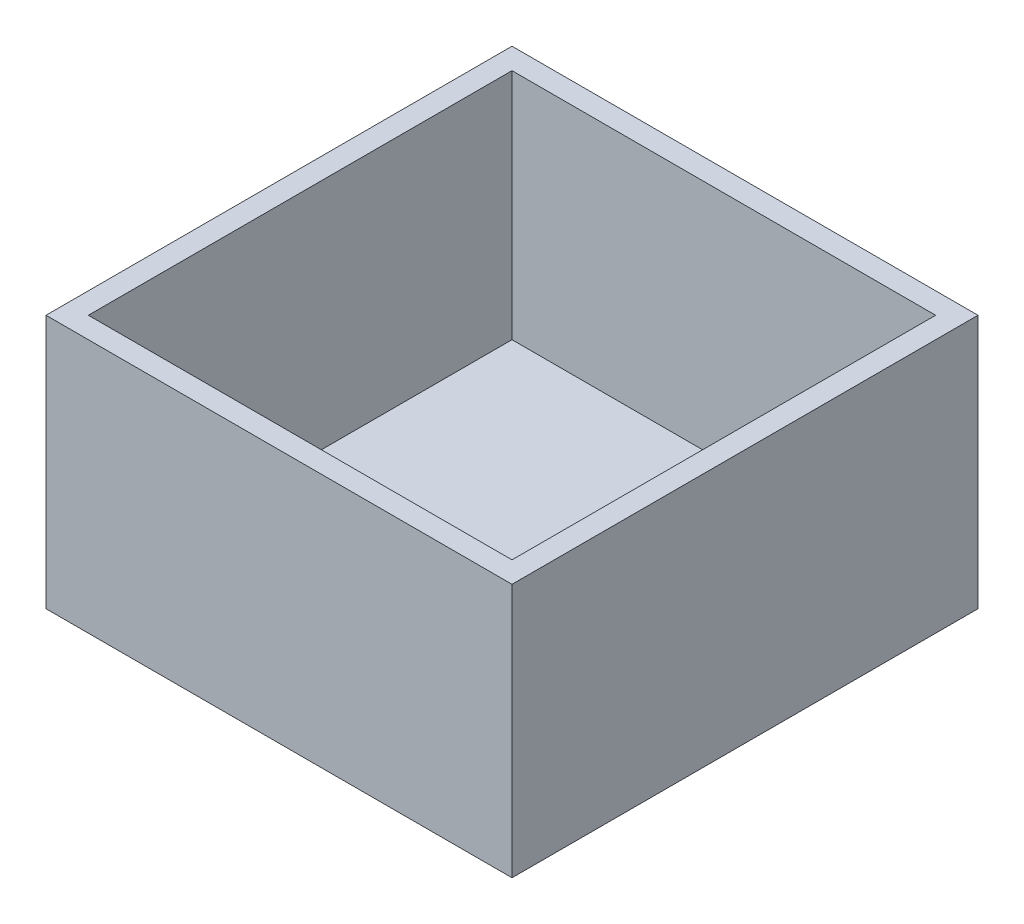
ISO-10303-21;
HEADER;
FILE_DESCRIPTION(('STEP AP214'),'2;1');
FILE_NAME('part.step','',(''),(''),'','','');
FILE_SCHEMA(('AUTOMOTIVE_DESIGN { 1 0 10303 214 1 1 1 1 }'));
ENDSEC;
DATA;
#1=APPLICATION_CONTEXT('core data for automotive mechanical design processes');
#2=APPLICATION_PROTOCOL_DEFINITION('international standard','automotive_design',2000,#1);
#3=PRODUCT_CONTEXT('',#1,'mechanical');
#4=PRODUCT('Part','Part','',(#3));
#5=PRODUCT_RELATED_PRODUCT_CATEGORY('part','',(#4));
#6=PRODUCT_DEFINITION_FORMATION('','',#4);
#7=PRODUCT_DEFINITION_CONTEXT('part definition',#1,'design');
#8=PRODUCT_DEFINITION('design','',#6,#7);
#9=PRODUCT_DEFINITION_SHAPE('','',#8);
#10=(LENGTH_UNIT() NAMED_UNIT(*) SI_UNIT(.MILLI.,.METRE.));
#11=(NAMED_UNIT(*) PLANE_ANGLE_UNIT() SI_UNIT($,.RADIAN.));
#12=(NAMED_UNIT(*) SI_UNIT($,.STERADIAN.) SOLID_ANGLE_UNIT());
#13=UNCERTAINTY_MEASURE_WITH_UNIT(LENGTH_MEASURE(1.E-05),#10,'distance_accuracy_value','');
#14=(GEOMETRIC_REPRESENTATION_CONTEXT(3) GLOBAL_UNCERTAINTY_ASSIGNED_CONTEXT((#13)) GLOBAL_UNIT_ASSIGNED_CONTEXT((#10,
#11,#12)) REPRESENTATION_CONTEXT('',''));
#15=CARTESIAN_POINT('',(0.,0.,0.));
#16=DIRECTION('',(0.,0.,1.));
#17=DIRECTION('',(1.,0.,0.));
#18=AXIS2_PLACEMENT_3D('',#15,#16,#17);
#19=CARTESIAN_POINT('',(0.,76.2,0.));
#20=DIRECTION('',(0.,-1.,0.));
#21=DIRECTION('',(0.,0.,-1.));
#22=AXIS2_PLACEMENT_3D('',#19,#20,#21);
#23=PLANE('',#22);
#24=DIRECTION('',(0.,0.,-1.));
#25=VECTOR('',#24,1.);
#26=CARTESIAN_POINT('',(69.85,76.2,69.85));
#27=LINE('',#26,#25);
#28=CARTESIAN_POINT('',(69.85,76.2,69.85));
#29=VERTEX_POINT('',#28);
#30=CARTESIAN_POINT('',(69.85,76.2,-69.85));
#31=VERTEX_POINT('',#30);
#32=EDGE_CURVE('E157',#29,#31,#27,.T.);
#33=ORIENTED_EDGE('',*,*,#32,.T.);
#34=DIRECTION('',(-1.,0.,0.));
#35=VECTOR('',#34,1.);
#36=CARTESIAN_POINT('',(-69.85,76.2,-69.85));
#37=LINE('',#36,#35);
#38=CARTESIAN_POINT('',(-69.85,76.2,-69.85));
#39=VERTEX_POINT('',#38);
#40=EDGE_CURVE('E92',#31,#39,#37,.T.);
#41=ORIENTED_EDGE('',*,*,#40,.T.);
#42=DIRECTION('',(0.,0.,1.));
#43=VECTOR('',#42,1.);
#44=CARTESIAN_POINT('',(-69.85,76.2,69.85));
#45=LINE('',#44,#43);
#46=CARTESIAN_POINT('',(-69.85,76.2,69.85));
#47=VERTEX_POINT('',#46);
#48=EDGE_CURVE('E162',#39,#47,#45,.T.);
#49=ORIENTED_EDGE('',*,*,#48,.T.);
#50=DIRECTION('',(1.,0.,0.));
#51=VECTOR('',#50,1.);
#52=CARTESIAN_POINT('',(-69.85,76.2,69.85));
#53=LINE('',#52,#51);
#54=EDGE_CURVE('E64',#47,#29,#53,.T.);
#55=ORIENTED_EDGE('',*,*,#54,.T.);
#56=EDGE_LOOP('',(#33,#41,#49,#55));
#57=FACE_BOUND('',#56,.T.);
#58=DIRECTION('',(0.,0.,-1.));
#59=VECTOR('',#58,1.);
#60=CARTESIAN_POINT('',(63.5,76.2,0.));
#61=LINE('',#60,#59);
#62=CARTESIAN_POINT('',(63.5,76.2,63.5));
#63=VERTEX_POINT('',#62);
#64=CARTESIAN_POINT('',(63.5,76.2,-63.5));
#65=VERTEX_POINT('',#64);
#66=EDGE_CURVE('E141',#63,#65,#61,.T.);
#67=ORIENTED_EDGE('',*,*,#66,.F.);
#68=DIRECTION('',(1.,0.,0.));
#69=VECTOR('',#68,1.);
#70=CARTESIAN_POINT('',(0.,76.2,63.5));
#71=LINE('',#70,#69);
#72=CARTESIAN_POINT('',(-63.5,76.2,63.5));
#73=VERTEX_POINT('',#72);
#74=EDGE_CURVE('E154',#73,#63,#71,.T.);
#75=ORIENTED_EDGE('',*,*,#74,.F.);
#76=DIRECTION('',(0.,0.,1.));
#77=VECTOR('',#76,1.);
#78=CARTESIAN_POINT('',(-63.5,76.2,0.));
#79=LINE('',#78,#77);
#80=CARTESIAN_POINT('',(-63.5,76.2,-63.5));
#81=VERTEX_POINT('',#80);
#82=EDGE_CURVE('E151',#81,#73,#79,.T.);
#83=ORIENTED_EDGE('',*,*,#82,.F.);
#84=DIRECTION('',(-1.,0.,0.));
#85=VECTOR('',#84,1.);
#86=CARTESIAN_POINT('',(0.,76.2,-63.5));
#87=LINE('',#86,#85);
#88=EDGE_CURVE('E130',#65,#81,#87,.T.);
#89=ORIENTED_EDGE('',*,*,#88,.F.);
#90=EDGE_LOOP('',(#67,#75,#83,#89));
#91=FACE_BOUND('',#90,.T.);
#92=ADVANCED_FACE('F39',(#57,#91),#23,.F.);
#93=CARTESIAN_POINT('',(69.85,76.2,69.85));
#94=DIRECTION('',(-1.,0.,0.));
#95=DIRECTION('',(0.,0.,1.));
#96=AXIS2_PLACEMENT_3D('',#93,#94,#95);
#97=PLANE('',#96);
#98=DIRECTION('',(0.,0.,-1.));
#99=VECTOR('',#98,1.);
#100=CARTESIAN_POINT('',(69.85,0.,69.85));
#101=LINE('',#100,#99);
#102=CARTESIAN_POINT('',(69.85,0.,69.85));
#103=VERTEX_POINT('',#102);
#104=CARTESIAN_POINT('',(69.85,0.,-69.85));
#105=VERTEX_POINT('',#104);
#106=EDGE_CURVE('E168',#103,#105,#101,.T.);
#107=ORIENTED_EDGE('',*,*,#106,.T.);
#108=DIRECTION('',(0.,-1.,0.));
#109=VECTOR('',#108,1.);
#110=CARTESIAN_POINT('',(69.85,76.2,-69.85));
#111=LINE('',#110,#109);
#112=EDGE_CURVE('E11',#31,#105,#111,.T.);
#113=ORIENTED_EDGE('',*,*,#112,.F.);
#114=ORIENTED_EDGE('',*,*,#32,.F.);
#115=DIRECTION('',(0.,-1.,0.));
#116=VECTOR('',#115,1.);
#117=CARTESIAN_POINT('',(69.85,76.2,69.85));
#118=LINE('',#117,#116);
#119=EDGE_CURVE('E167',#29,#103,#118,.T.);
#120=ORIENTED_EDGE('',*,*,#119,.T.);
#121=EDGE_LOOP('',(#107,#113,#114,#120));
#122=FACE_BOUND('',#121,.T.);
#123=ADVANCED_FACE('F41',(#122),#97,.F.);
#124=CARTESIAN_POINT('',(-69.85,76.2,-69.85));
#125=DIRECTION('',(0.,0.,1.));
#126=DIRECTION('',(1.,0.,0.));
#127=AXIS2_PLACEMENT_3D('',#124,#125,#126);
#128=PLANE('',#127);
#129=DIRECTION('',(-1.,0.,0.));
#130=VECTOR('',#129,1.);
#131=CARTESIAN_POINT('',(-69.85,0.,-69.85));
#132=LINE('',#131,#130);
#133=CARTESIAN_POINT('',(-69.85,0.,-69.85));
#134=VERTEX_POINT('',#133);
#135=EDGE_CURVE('E172',#105,#134,#132,.T.);
#136=ORIENTED_EDGE('',*,*,#135,.T.);
#137=DIRECTION('',(0.,-1.,0.));
#138=VECTOR('',#137,1.);
#139=CARTESIAN_POINT('',(-69.85,76.2,-69.85));
#140=LINE('',#139,#138);
#141=EDGE_CURVE('E48',#39,#134,#140,.T.);
#142=ORIENTED_EDGE('',*,*,#141,.F.);
#143=ORIENTED_EDGE('',*,*,#40,.F.);
#144=ORIENTED_EDGE('',*,*,#112,.T.);
#145=EDGE_LOOP('',(#136,#142,#143,#144));
#146=FACE_BOUND('',#145,.T.);
#147=ADVANCED_FACE('F206',(#146),#128,.F.);
#148=CARTESIAN_POINT('',(-69.85,76.2,69.85));
#149=DIRECTION('',(1.,0.,0.));
#150=DIRECTION('',(0.,0.,-1.));
#151=AXIS2_PLACEMENT_3D('',#148,#149,#150);
#152=PLANE('',#151);
#153=DIRECTION('',(0.,0.,1.));
#154=VECTOR('',#153,1.);
#155=CARTESIAN_POINT('',(-69.85,0.,69.85));
#156=LINE('',#155,#154);
#157=CARTESIAN_POINT('',(-69.85,0.,69.85));
#158=VERTEX_POINT('',#157);
#159=EDGE_CURVE('E175',#134,#158,#156,.T.);
#160=ORIENTED_EDGE('',*,*,#159,.T.);
#161=DIRECTION('',(0.,-1.,0.));
#162=VECTOR('',#161,1.);
#163=CARTESIAN_POINT('',(-69.85,76.2,69.85));
#164=LINE('',#163,#162);
#165=EDGE_CURVE('E182',#47,#158,#164,.T.);
#166=ORIENTED_EDGE('',*,*,#165,.F.);
#167=ORIENTED_EDGE('',*,*,#48,.F.);
#168=ORIENTED_EDGE('',*,*,#141,.T.);
#169=EDGE_LOOP('',(#160,#166,#167,#168));
#170=FACE_BOUND('',#169,.T.);
#171=ADVANCED_FACE('F189',(#170),#152,.F.);
#172=CARTESIAN_POINT('',(-69.85,76.2,69.85));
#173=DIRECTION('',(0.,0.,-1.));
#174=DIRECTION('',(-1.,0.,0.));
#175=AXIS2_PLACEMENT_3D('',#172,#173,#174);
#176=PLANE('',#175);
#177=DIRECTION('',(1.,0.,0.));
#178=VECTOR('',#177,1.);
#179=CARTESIAN_POINT('',(-69.85,0.,69.85));
#180=LINE('',#179,#178);
#181=EDGE_CURVE('E85',#158,#103,#180,.T.);
#182=ORIENTED_EDGE('',*,*,#181,.T.);
#183=ORIENTED_EDGE('',*,*,#119,.F.);
#184=ORIENTED_EDGE('',*,*,#54,.F.);
#185=ORIENTED_EDGE('',*,*,#165,.T.);
#186=EDGE_LOOP('',(#182,#183,#184,#185));
#187=FACE_BOUND('',#186,.T.);
#188=ADVANCED_FACE('F197',(#187),#176,.F.);
#189=CARTESIAN_POINT('',(0.,0.,0.));
#190=DIRECTION('',(0.,-1.,0.));
#191=DIRECTION('',(0.,0.,-1.));
#192=AXIS2_PLACEMENT_3D('',#189,#190,#191);
#193=PLANE('',#192);
#194=ORIENTED_EDGE('',*,*,#106,.F.);
#195=ORIENTED_EDGE('',*,*,#181,.F.);
#196=ORIENTED_EDGE('',*,*,#159,.F.);
#197=ORIENTED_EDGE('',*,*,#135,.F.);
#198=EDGE_LOOP('',(#194,#195,#196,#197));
#199=FACE_BOUND('',#198,.T.);
#200=ADVANCED_FACE('F193',(#199),#193,.T.);
#201=CARTESIAN_POINT('',(63.5,76.2,69.85));
#202=DIRECTION('',(-1.,0.,0.));
#203=DIRECTION('',(0.,0.,1.));
#204=AXIS2_PLACEMENT_3D('',#201,#202,#203);
#205=PLANE('',#204);
#206=DIRECTION('',(0.,0.,-1.));
#207=VECTOR('',#206,1.);
#208=CARTESIAN_POINT('',(63.5,6.35,0.));
#209=LINE('',#208,#207);
#210=CARTESIAN_POINT('',(63.5,6.35,63.5));
#211=VERTEX_POINT('',#210);
#212=CARTESIAN_POINT('',(63.5,6.35,-63.5));
#213=VERTEX_POINT('',#212);
#214=EDGE_CURVE('E120',#211,#213,#209,.T.);
#215=ORIENTED_EDGE('',*,*,#214,.F.);
#216=DIRECTION('',(0.,-1.,0.));
#217=VECTOR('',#216,1.);
#218=CARTESIAN_POINT('',(63.5,76.2,63.5));
#219=LINE('',#218,#217);
#220=EDGE_CURVE('E145',#63,#211,#219,.T.);
#221=ORIENTED_EDGE('',*,*,#220,.F.);
#222=ORIENTED_EDGE('',*,*,#66,.T.);
#223=DIRECTION('',(0.,-1.,0.));
#224=VECTOR('',#223,1.);
#225=CARTESIAN_POINT('',(63.5,76.2,-63.5));
#226=LINE('',#225,#224);
#227=EDGE_CURVE('E134',#65,#213,#226,.T.);
#228=ORIENTED_EDGE('',*,*,#227,.T.);
#229=EDGE_LOOP('',(#215,#221,#222,#228));
#230=FACE_BOUND('',#229,.T.);
#231=ADVANCED_FACE('F204',(#230),#205,.T.);
#232=CARTESIAN_POINT('',(-69.85,76.2,-63.5));
#233=DIRECTION('',(0.,0.,1.));
#234=DIRECTION('',(1.,0.,0.));
#235=AXIS2_PLACEMENT_3D('',#232,#233,#234);
#236=PLANE('',#235);
#237=DIRECTION('',(-1.,0.,0.));
#238=VECTOR('',#237,1.);
#239=CARTESIAN_POINT('',(0.,6.35,-63.5));
#240=LINE('',#239,#238);
#241=CARTESIAN_POINT('',(-63.5,6.35,-63.5));
#242=VERTEX_POINT('',#241);
#243=EDGE_CURVE('E114',#213,#242,#240,.T.);
#244=ORIENTED_EDGE('',*,*,#243,.F.);
#245=ORIENTED_EDGE('',*,*,#227,.F.);
#246=ORIENTED_EDGE('',*,*,#88,.T.);
#247=DIRECTION('',(0.,-1.,0.));
#248=VECTOR('',#247,1.);
#249=CARTESIAN_POINT('',(-63.5,76.2,-63.5));
#250=LINE('',#249,#248);
#251=EDGE_CURVE('E127',#81,#242,#250,.T.);
#252=ORIENTED_EDGE('',*,*,#251,.T.);
#253=EDGE_LOOP('',(#244,#245,#246,#252));
#254=FACE_BOUND('',#253,.T.);
#255=ADVANCED_FACE('F128',(#254),#236,.T.);
#256=CARTESIAN_POINT('',(-63.5,76.2,69.85));
#257=DIRECTION('',(1.,0.,0.));
#258=DIRECTION('',(0.,0.,-1.));
#259=AXIS2_PLACEMENT_3D('',#256,#257,#258);
#260=PLANE('',#259);
#261=DIRECTION('',(0.,0.,1.));
#262=VECTOR('',#261,1.);
#263=CARTESIAN_POINT('',(-63.5,6.35,0.));
#264=LINE('',#263,#262);
#265=CARTESIAN_POINT('',(-63.5,6.35,63.5));
#266=VERTEX_POINT('',#265);
#267=EDGE_CURVE('E118',#242,#266,#264,.T.);
#268=ORIENTED_EDGE('',*,*,#267,.F.);
#269=ORIENTED_EDGE('',*,*,#251,.F.);
#270=ORIENTED_EDGE('',*,*,#82,.T.);
#271=DIRECTION('',(0.,-1.,0.));
#272=VECTOR('',#271,1.);
#273=CARTESIAN_POINT('',(-63.5,76.2,63.5));
#274=LINE('',#273,#272);
#275=EDGE_CURVE('E55',#73,#266,#274,.T.);
#276=ORIENTED_EDGE('',*,*,#275,.T.);
#277=EDGE_LOOP('',(#268,#269,#270,#276));
#278=FACE_BOUND('',#277,.T.);
#279=ADVANCED_FACE('F136',(#278),#260,.T.);
#280=CARTESIAN_POINT('',(-69.85,76.2,63.5));
#281=DIRECTION('',(0.,0.,-1.));
#282=DIRECTION('',(-1.,0.,0.));
#283=AXIS2_PLACEMENT_3D('',#280,#281,#282);
#284=PLANE('',#283);
#285=DIRECTION('',(1.,0.,0.));
#286=VECTOR('',#285,1.);
#287=CARTESIAN_POINT('',(0.,6.35,63.5));
#288=LINE('',#287,#286);
#289=EDGE_CURVE('E138',#266,#211,#288,.T.);
#290=ORIENTED_EDGE('',*,*,#289,.F.);
#291=ORIENTED_EDGE('',*,*,#275,.F.);
#292=ORIENTED_EDGE('',*,*,#74,.T.);
#293=ORIENTED_EDGE('',*,*,#220,.T.);
#294=EDGE_LOOP('',(#290,#291,#292,#293));
#295=FACE_BOUND('',#294,.T.);
#296=ADVANCED_FACE('F217',(#295),#284,.T.);
#297=CARTESIAN_POINT('',(0.,6.35,0.));
#298=DIRECTION('',(0.,-1.,0.));
#299=DIRECTION('',(0.,0.,-1.));
#300=AXIS2_PLACEMENT_3D('',#297,#298,#299);
#301=PLANE('',#300);
#302=ORIENTED_EDGE('',*,*,#214,.T.);
#303=ORIENTED_EDGE('',*,*,#243,.T.);
#304=ORIENTED_EDGE('',*,*,#267,.T.);
#305=ORIENTED_EDGE('',*,*,#289,.T.);
#306=EDGE_LOOP('',(#302,#303,#304,#305));
#307=FACE_BOUND('',#306,.T.);
#308=ADVANCED_FACE('F116',(#307),#301,.F.);
#309=CLOSED_SHELL('',(#92,#123,#147,#171,#188,#200,#231,#255,#279,#296,#308));
#310=MANIFOLD_SOLID_BREP('B2',#309);
#311=ADVANCED_BREP_SHAPE_REPRESENTATION('',(#18,#310),#14);
#312=SHAPE_DEFINITION_REPRESENTATION(#9,#311);
ENDSEC;
END-ISO-10303-21;
